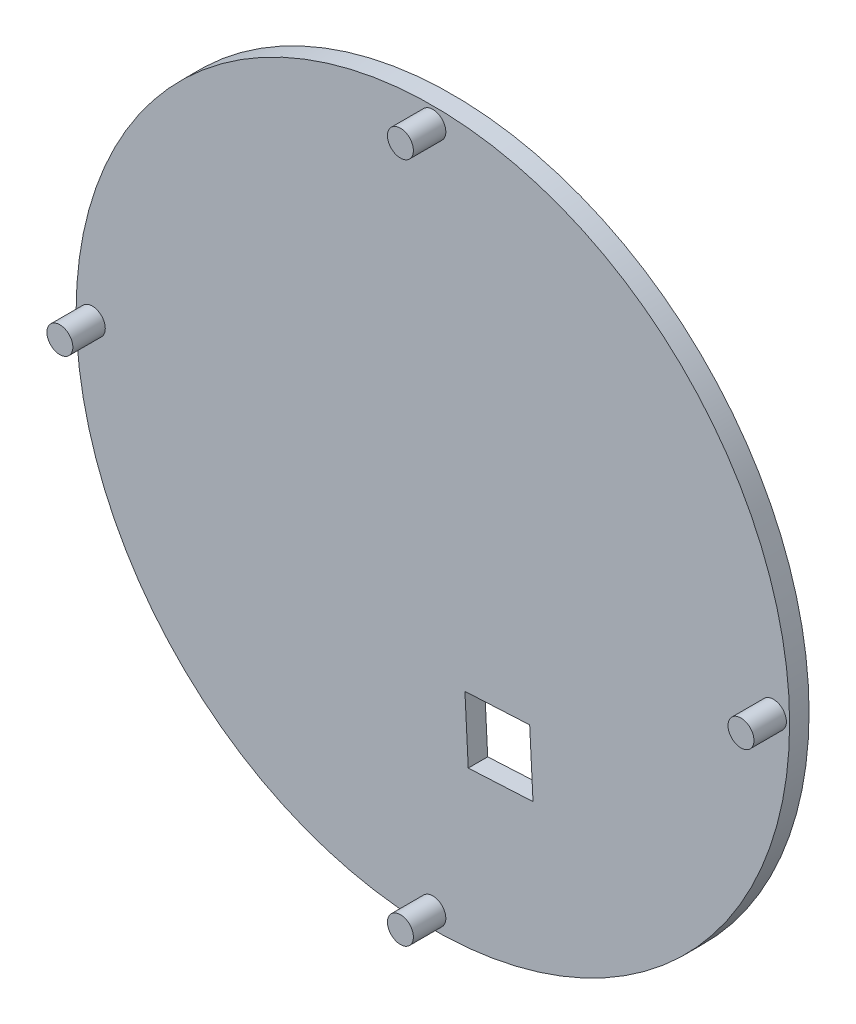
ISO-10303-21;
HEADER;
FILE_DESCRIPTION(('STEP AP214'),'2;1');
FILE_NAME('part.step','',(''),(''),'','','');
FILE_SCHEMA(('AUTOMOTIVE_DESIGN { 1 0 10303 214 1 1 1 1 }'));
ENDSEC;
DATA;
#1=APPLICATION_CONTEXT('core data for automotive mechanical design processes');
#2=APPLICATION_PROTOCOL_DEFINITION('international standard','automotive_design',2000,#1);
#3=PRODUCT_CONTEXT('',#1,'mechanical');
#4=PRODUCT('Part','Part','',(#3));
#5=PRODUCT_RELATED_PRODUCT_CATEGORY('part','',(#4));
#6=PRODUCT_DEFINITION_FORMATION('','',#4);
#7=PRODUCT_DEFINITION_CONTEXT('part definition',#1,'design');
#8=PRODUCT_DEFINITION('design','',#6,#7);
#9=PRODUCT_DEFINITION_SHAPE('','',#8);
#10=(LENGTH_UNIT() NAMED_UNIT(*) SI_UNIT(.MILLI.,.METRE.));
#11=(NAMED_UNIT(*) PLANE_ANGLE_UNIT() SI_UNIT($,.RADIAN.));
#12=(NAMED_UNIT(*) SI_UNIT($,.STERADIAN.) SOLID_ANGLE_UNIT());
#13=UNCERTAINTY_MEASURE_WITH_UNIT(LENGTH_MEASURE(1.E-05),#10,'distance_accuracy_value','');
#14=(GEOMETRIC_REPRESENTATION_CONTEXT(3) GLOBAL_UNCERTAINTY_ASSIGNED_CONTEXT((#13)) GLOBAL_UNIT_ASSIGNED_CONTEXT((#10,
#11,#12)) REPRESENTATION_CONTEXT('',''));
#15=CARTESIAN_POINT('',(0.,0.,0.));
#16=DIRECTION('',(0.,0.,1.));
#17=DIRECTION('',(1.,0.,0.));
#18=AXIS2_PLACEMENT_3D('',#15,#16,#17);
#19=CARTESIAN_POINT('',(0.,0.,3.));
#20=DIRECTION('',(0.,0.,-1.));
#21=DIRECTION('',(-1.,0.,0.));
#22=AXIS2_PLACEMENT_3D('',#19,#20,#21);
#23=CYLINDRICAL_SURFACE('',#22,55.);
#24=CARTESIAN_POINT('',(0.,0.,3.));
#25=DIRECTION('',(0.,0.,1.));
#26=DIRECTION('',(1.,0.,0.));
#27=AXIS2_PLACEMENT_3D('',#24,#25,#26);
#28=CIRCLE('',#27,55.);
#29=CARTESIAN_POINT('',(55.,0.,3.));
#30=VERTEX_POINT('',#29);
#31=EDGE_CURVE('E305',#30,#30,#28,.T.);
#32=ORIENTED_EDGE('',*,*,#31,.F.);
#33=EDGE_LOOP('',(#32));
#34=FACE_BOUND('',#33,.T.);
#35=CARTESIAN_POINT('',(0.,0.,0.));
#36=DIRECTION('',(0.,0.,1.));
#37=DIRECTION('',(1.,0.,0.));
#38=AXIS2_PLACEMENT_3D('',#35,#36,#37);
#39=CIRCLE('',#38,55.);
#40=CARTESIAN_POINT('',(55.,0.,0.));
#41=VERTEX_POINT('',#40);
#42=EDGE_CURVE('E45',#41,#41,#39,.T.);
#43=ORIENTED_EDGE('',*,*,#42,.T.);
#44=EDGE_LOOP('',(#43));
#45=FACE_BOUND('',#44,.T.);
#46=ADVANCED_FACE('F39',(#34,#45),#23,.T.);
#47=CARTESIAN_POINT('',(0.,0.,3.));
#48=DIRECTION('',(0.,0.,1.));
#49=DIRECTION('',(1.,0.,0.));
#50=AXIS2_PLACEMENT_3D('',#47,#48,#49);
#51=PLANE('',#50);
#52=DIRECTION('',(-0.998678015366775,-0.0514025449085839,0.));
#53=VECTOR('',#52,1.);
#54=CARTESIAN_POINT('',(1.07691285464527,-20.9228783188225,3.));
#55=LINE('',#54,#53);
#56=CARTESIAN_POINT('',(14.9275909821923,-20.2099757681399,3.));
#57=VERTEX_POINT('',#56);
#58=CARTESIAN_POINT('',(4.9408108285245,-20.7240012172258,3.));
#59=VERTEX_POINT('',#58);
#60=EDGE_CURVE('E186',#57,#59,#55,.T.);
#61=ORIENTED_EDGE('',*,*,#60,.F.);
#62=DIRECTION('',(-0.0514025449085844,0.998678015366775,0.));
#63=VECTOR('',#62,1.);
#64=CARTESIAN_POINT('',(13.850678127547,0.712902550682571,3.));
#65=LINE('',#64,#63);
#66=CARTESIAN_POINT('',(15.4416164312781,-30.1967559218077,3.));
#67=VERTEX_POINT('',#66);
#68=EDGE_CURVE('E178',#67,#57,#65,.T.);
#69=ORIENTED_EDGE('',*,*,#68,.F.);
#70=DIRECTION('',(0.998678015366775,0.0514025449085843,0.));
#71=VECTOR('',#70,1.);
#72=CARTESIAN_POINT('',(1.59093830373112,-30.9096584724902,3.));
#73=LINE('',#72,#71);
#74=CARTESIAN_POINT('',(5.45483627761034,-30.7107813708935,3.));
#75=VERTEX_POINT('',#74);
#76=EDGE_CURVE('E157',#75,#67,#73,.T.);
#77=ORIENTED_EDGE('',*,*,#76,.F.);
#78=DIRECTION('',(0.051402544908584,-0.998678015366775,0.));
#79=VECTOR('',#78,1.);
#80=CARTESIAN_POINT('',(3.86389797387923,0.198877101596725,3.));
#81=LINE('',#80,#79);
#82=EDGE_CURVE('E184',#59,#75,#81,.T.);
#83=ORIENTED_EDGE('',*,*,#82,.F.);
#84=EDGE_LOOP('',(#61,#69,#77,#83));
#85=FACE_BOUND('',#84,.T.);
#86=CARTESIAN_POINT('',(0.,52.50213424043,3.));
#87=DIRECTION('',(0.,0.,1.));
#88=DIRECTION('',(1.,0.,0.));
#89=AXIS2_PLACEMENT_3D('',#86,#87,#88);
#90=CIRCLE('',#89,2.);
#91=CARTESIAN_POINT('',(2.,52.50213424043,3.));
#92=VERTEX_POINT('',#91);
#93=EDGE_CURVE('E11',#92,#92,#90,.T.);
#94=ORIENTED_EDGE('',*,*,#93,.F.);
#95=EDGE_LOOP('',(#94));
#96=FACE_BOUND('',#95,.T.);
#97=CARTESIAN_POINT('',(52.50213424043,-1.83310221949899E-13,3.));
#98=DIRECTION('',(0.,0.,1.));
#99=DIRECTION('',(1.,0.,0.));
#100=AXIS2_PLACEMENT_3D('',#97,#98,#99);
#101=CIRCLE('',#100,2.);
#102=CARTESIAN_POINT('',(54.50213424043,-1.83310221949899E-13,3.));
#103=VERTEX_POINT('',#102);
#104=EDGE_CURVE('E50',#103,#103,#101,.T.);
#105=ORIENTED_EDGE('',*,*,#104,.F.);
#106=EDGE_LOOP('',(#105));
#107=FACE_BOUND('',#106,.T.);
#108=CARTESIAN_POINT('',(-3.66620443899797E-13,-52.50213424043,3.));
#109=DIRECTION('',(0.,0.,1.));
#110=DIRECTION('',(1.,0.,0.));
#111=AXIS2_PLACEMENT_3D('',#108,#109,#110);
#112=CIRCLE('',#111,2.);
#113=CARTESIAN_POINT('',(1.99999999999963,-52.50213424043,3.));
#114=VERTEX_POINT('',#113);
#115=EDGE_CURVE('E292',#114,#114,#112,.T.);
#116=ORIENTED_EDGE('',*,*,#115,.F.);
#117=EDGE_LOOP('',(#116));
#118=FACE_BOUND('',#117,.T.);
#119=CARTESIAN_POINT('',(-52.50213424043,5.49930665849696E-13,3.));
#120=DIRECTION('',(0.,0.,1.));
#121=DIRECTION('',(1.,0.,0.));
#122=AXIS2_PLACEMENT_3D('',#119,#120,#121);
#123=CIRCLE('',#122,2.);
#124=CARTESIAN_POINT('',(-50.50213424043,5.49930665849696E-13,3.));
#125=VERTEX_POINT('',#124);
#126=EDGE_CURVE('E297',#125,#125,#123,.T.);
#127=ORIENTED_EDGE('',*,*,#126,.F.);
#128=EDGE_LOOP('',(#127));
#129=FACE_BOUND('',#128,.T.);
#130=ORIENTED_EDGE('',*,*,#31,.T.);
#131=EDGE_LOOP('',(#130));
#132=FACE_BOUND('',#131,.T.);
#133=ADVANCED_FACE('F311',(#85,#96,#107,#118,#129,#132),#51,.T.);
#134=CARTESIAN_POINT('',(0.,0.,0.));
#135=DIRECTION('',(0.,0.,1.));
#136=DIRECTION('',(1.,0.,0.));
#137=AXIS2_PLACEMENT_3D('',#134,#135,#136);
#138=PLANE('',#137);
#139=DIRECTION('',(0.0514025449085844,-0.998678015366775,0.));
#140=VECTOR('',#139,1.);
#141=CARTESIAN_POINT('',(14.9275909821923,-20.2099757681399,0.));
#142=LINE('',#141,#140);
#143=CARTESIAN_POINT('',(14.9275909821923,-20.2099757681399,0.));
#144=VERTEX_POINT('',#143);
#145=CARTESIAN_POINT('',(15.4416164312781,-30.1967559218077,0.));
#146=VERTEX_POINT('',#145);
#147=EDGE_CURVE('E164',#144,#146,#142,.T.);
#148=ORIENTED_EDGE('',*,*,#147,.F.);
#149=DIRECTION('',(0.998678015366775,0.0514025449085839,0.));
#150=VECTOR('',#149,1.);
#151=CARTESIAN_POINT('',(14.9275909821923,-20.2099757681399,0.));
#152=LINE('',#151,#150);
#153=CARTESIAN_POINT('',(4.9408108285245,-20.7240012172258,0.));
#154=VERTEX_POINT('',#153);
#155=EDGE_CURVE('E64',#154,#144,#152,.T.);
#156=ORIENTED_EDGE('',*,*,#155,.F.);
#157=DIRECTION('',(-0.051402544908584,0.998678015366775,0.));
#158=VECTOR('',#157,1.);
#159=CARTESIAN_POINT('',(4.9408108285245,-20.7240012172258,0.));
#160=LINE('',#159,#158);
#161=CARTESIAN_POINT('',(5.45483627761034,-30.7107813708935,0.));
#162=VERTEX_POINT('',#161);
#163=EDGE_CURVE('E172',#162,#154,#160,.T.);
#164=ORIENTED_EDGE('',*,*,#163,.F.);
#165=DIRECTION('',(-0.998678015366775,-0.0514025449085843,0.));
#166=VECTOR('',#165,1.);
#167=CARTESIAN_POINT('',(5.45483627761034,-30.7107813708935,0.));
#168=LINE('',#167,#166);
#169=EDGE_CURVE('E156',#146,#162,#168,.T.);
#170=ORIENTED_EDGE('',*,*,#169,.F.);
#171=EDGE_LOOP('',(#148,#156,#164,#170));
#172=FACE_BOUND('',#171,.T.);
#173=CARTESIAN_POINT('',(18.7130524542113,0.115332129058666,0.));
#174=DIRECTION('',(0.,0.,-1.));
#175=DIRECTION('',(1.,0.,0.));
#176=AXIS2_PLACEMENT_3D('',#173,#174,#175);
#177=CIRCLE('',#176,1.99980087548018);
#178=CARTESIAN_POINT('',(18.9130701906319,2.10510509266242,0.));
#179=VERTEX_POINT('',#178);
#180=CARTESIAN_POINT('',(18.9130701906319,-1.87444083454508,0.));
#181=VERTEX_POINT('',#180);
#182=EDGE_CURVE('E229',#179,#181,#177,.T.);
#183=ORIENTED_EDGE('',*,*,#182,.F.);
#184=DIRECTION('',(0.996966855452382,-0.0778273032385734,0.));
#185=VECTOR('',#184,1.);
#186=CARTESIAN_POINT('',(18.9130701906319,2.10510509266242,0.));
#187=LINE('',#186,#185);
#188=CARTESIAN_POINT('',(2.,3.42540840587969,0.));
#189=VERTEX_POINT('',#188);
#190=EDGE_CURVE('E189',#189,#179,#187,.T.);
#191=ORIENTED_EDGE('',*,*,#190,.F.);
#192=DIRECTION('',(0.,-1.,0.));
#193=VECTOR('',#192,1.);
#194=CARTESIAN_POINT('',(2.,3.42540840587969,0.));
#195=LINE('',#194,#193);
#196=CARTESIAN_POINT('',(2.,8.42540840587969,0.));
#197=VERTEX_POINT('',#196);
#198=EDGE_CURVE('E192',#197,#189,#195,.T.);
#199=ORIENTED_EDGE('',*,*,#198,.F.);
#200=CARTESIAN_POINT('',(0.,8.42540840587969,0.));
#201=DIRECTION('',(0.,0.,-1.));
#202=DIRECTION('',(1.,0.,0.));
#203=AXIS2_PLACEMENT_3D('',#200,#201,#202);
#204=CIRCLE('',#203,2.);
#205=CARTESIAN_POINT('',(-2.,8.42540840587969,0.));
#206=VERTEX_POINT('',#205);
#207=EDGE_CURVE('E254',#206,#197,#204,.T.);
#208=ORIENTED_EDGE('',*,*,#207,.F.);
#209=DIRECTION('',(0.,1.,0.));
#210=VECTOR('',#209,1.);
#211=CARTESIAN_POINT('',(-2.,8.42540840587969,0.));
#212=LINE('',#211,#210);
#213=CARTESIAN_POINT('',(-2.,3.42540840587969,0.));
#214=VERTEX_POINT('',#213);
#215=EDGE_CURVE('E252',#214,#206,#212,.T.);
#216=ORIENTED_EDGE('',*,*,#215,.F.);
#217=DIRECTION('',(0.994719011494267,0.102635706125444,0.));
#218=VECTOR('',#217,1.);
#219=CARTESIAN_POINT('',(-2.,3.42540840587969,0.));
#220=LINE('',#219,#218);
#221=CARTESIAN_POINT('',(-15.9260661609197,1.98850852012348,0.));
#222=VERTEX_POINT('',#221);
#223=EDGE_CURVE('E248',#222,#214,#220,.T.);
#224=ORIENTED_EDGE('',*,*,#223,.F.);
#225=CARTESIAN_POINT('',(-15.7208906553337,0.,0.));
#226=DIRECTION('',(0.,0.,-1.));
#227=DIRECTION('',(1.,0.,0.));
#228=AXIS2_PLACEMENT_3D('',#225,#226,#227);
#229=CIRCLE('',#228,1.99906556238061);
#230=CARTESIAN_POINT('',(-15.9575359763334,-1.98500934878028,0.));
#231=VERTEX_POINT('',#230);
#232=EDGE_CURVE('E246',#231,#222,#229,.T.);
#233=ORIENTED_EDGE('',*,*,#232,.F.);
#234=DIRECTION('',(-0.996966855452382,0.0778273032385739,0.));
#235=VECTOR('',#234,1.);
#236=CARTESIAN_POINT('',(-15.9575359763334,-1.98500934878028,0.));
#237=LINE('',#236,#235);
#238=CARTESIAN_POINT('',(-2.,-3.07459159412031,0.));
#239=VERTEX_POINT('',#238);
#240=EDGE_CURVE('E244',#239,#231,#237,.T.);
#241=ORIENTED_EDGE('',*,*,#240,.F.);
#242=DIRECTION('',(0.,1.,0.));
#243=VECTOR('',#242,1.);
#244=CARTESIAN_POINT('',(-2.,-3.07459159412031,0.));
#245=LINE('',#244,#243);
#246=CARTESIAN_POINT('',(-2.,-8.57459159412032,0.));
#247=VERTEX_POINT('',#246);
#248=EDGE_CURVE('E238',#247,#239,#245,.T.);
#249=ORIENTED_EDGE('',*,*,#248,.F.);
#250=CARTESIAN_POINT('',(0.,-8.57459159412032,0.));
#251=DIRECTION('',(0.,0.,-1.));
#252=DIRECTION('',(1.,0.,0.));
#253=AXIS2_PLACEMENT_3D('',#250,#251,#252);
#254=CIRCLE('',#253,2.);
#255=CARTESIAN_POINT('',(2.,-8.57459159412032,0.));
#256=VERTEX_POINT('',#255);
#257=EDGE_CURVE('E240',#256,#247,#254,.T.);
#258=ORIENTED_EDGE('',*,*,#257,.F.);
#259=DIRECTION('',(0.,-1.,0.));
#260=VECTOR('',#259,1.);
#261=CARTESIAN_POINT('',(2.,-8.57459159412032,0.));
#262=LINE('',#261,#260);
#263=CARTESIAN_POINT('',(2.,-3.57459159412031,0.));
#264=VERTEX_POINT('',#263);
#265=EDGE_CURVE('E233',#264,#256,#262,.T.);
#266=ORIENTED_EDGE('',*,*,#265,.F.);
#267=DIRECTION('',(-0.994985544811296,-0.100018826310689,0.));
#268=VECTOR('',#267,1.);
#269=CARTESIAN_POINT('',(2.,-3.57459159412031,0.));
#270=LINE('',#269,#268);
#271=EDGE_CURVE('E231',#181,#264,#270,.T.);
#272=ORIENTED_EDGE('',*,*,#271,.F.);
#273=EDGE_LOOP('',(#183,#191,#199,#208,#216,#224,#233,#241,#249,#258,#266,#272));
#274=FACE_BOUND('',#273,.T.);
#275=ORIENTED_EDGE('',*,*,#42,.F.);
#276=EDGE_LOOP('',(#275));
#277=FACE_BOUND('',#276,.T.);
#278=ADVANCED_FACE('F166',(#172,#274,#277),#138,.F.);
#279=CARTESIAN_POINT('',(-52.50213424043,5.49930665849696E-13,8.));
#280=DIRECTION('',(0.,0.,-1.));
#281=DIRECTION('',(-1.,0.,0.));
#282=AXIS2_PLACEMENT_3D('',#279,#280,#281);
#283=CYLINDRICAL_SURFACE('',#282,2.);
#284=CARTESIAN_POINT('',(-52.50213424043,5.49930665849696E-13,8.));
#285=DIRECTION('',(0.,0.,1.));
#286=DIRECTION('',(1.,0.,0.));
#287=AXIS2_PLACEMENT_3D('',#284,#285,#286);
#288=CIRCLE('',#287,2.);
#289=CARTESIAN_POINT('',(-50.50213424043,5.49930665849696E-13,8.));
#290=VERTEX_POINT('',#289);
#291=EDGE_CURVE('E265',#290,#290,#288,.T.);
#292=ORIENTED_EDGE('',*,*,#291,.F.);
#293=EDGE_LOOP('',(#292));
#294=FACE_BOUND('',#293,.T.);
#295=ORIENTED_EDGE('',*,*,#126,.T.);
#296=EDGE_LOOP('',(#295));
#297=FACE_BOUND('',#296,.T.);
#298=ADVANCED_FACE('F315',(#294,#297),#283,.T.);
#299=CARTESIAN_POINT('',(-52.50213424043,5.49930665849696E-13,8.));
#300=DIRECTION('',(0.,0.,1.));
#301=DIRECTION('',(1.,0.,0.));
#302=AXIS2_PLACEMENT_3D('',#299,#300,#301);
#303=PLANE('',#302);
#304=ORIENTED_EDGE('',*,*,#291,.T.);
#305=EDGE_LOOP('',(#304));
#306=FACE_BOUND('',#305,.T.);
#307=ADVANCED_FACE('F317',(#306),#303,.T.);
#308=CARTESIAN_POINT('',(-3.66620443899797E-13,-52.50213424043,8.));
#309=DIRECTION('',(0.,0.,-1.));
#310=DIRECTION('',(-1.,0.,0.));
#311=AXIS2_PLACEMENT_3D('',#308,#309,#310);
#312=CYLINDRICAL_SURFACE('',#311,2.);
#313=CARTESIAN_POINT('',(-3.66620443899797E-13,-52.50213424043,8.));
#314=DIRECTION('',(0.,0.,1.));
#315=DIRECTION('',(1.,0.,0.));
#316=AXIS2_PLACEMENT_3D('',#313,#314,#315);
#317=CIRCLE('',#316,2.);
#318=CARTESIAN_POINT('',(1.99999999999963,-52.50213424043,8.));
#319=VERTEX_POINT('',#318);
#320=EDGE_CURVE('E294',#319,#319,#317,.T.);
#321=ORIENTED_EDGE('',*,*,#320,.F.);
#322=EDGE_LOOP('',(#321));
#323=FACE_BOUND('',#322,.T.);
#324=ORIENTED_EDGE('',*,*,#115,.T.);
#325=EDGE_LOOP('',(#324));
#326=FACE_BOUND('',#325,.T.);
#327=ADVANCED_FACE('F341',(#323,#326),#312,.T.);
#328=CARTESIAN_POINT('',(-3.66620443899797E-13,-52.50213424043,8.));
#329=DIRECTION('',(0.,0.,1.));
#330=DIRECTION('',(1.,0.,0.));
#331=AXIS2_PLACEMENT_3D('',#328,#329,#330);
#332=PLANE('',#331);
#333=ORIENTED_EDGE('',*,*,#320,.T.);
#334=EDGE_LOOP('',(#333));
#335=FACE_BOUND('',#334,.T.);
#336=ADVANCED_FACE('F348',(#335),#332,.T.);
#337=CARTESIAN_POINT('',(52.50213424043,-1.83310221949899E-13,8.));
#338=DIRECTION('',(0.,0.,-1.));
#339=DIRECTION('',(-1.,0.,0.));
#340=AXIS2_PLACEMENT_3D('',#337,#338,#339);
#341=CYLINDRICAL_SURFACE('',#340,2.);
#342=CARTESIAN_POINT('',(52.50213424043,-1.83310221949899E-13,8.));
#343=DIRECTION('',(0.,0.,1.));
#344=DIRECTION('',(1.,0.,0.));
#345=AXIS2_PLACEMENT_3D('',#342,#343,#344);
#346=CIRCLE('',#345,2.);
#347=CARTESIAN_POINT('',(54.50213424043,-1.83310221949899E-13,8.));
#348=VERTEX_POINT('',#347);
#349=EDGE_CURVE('E290',#348,#348,#346,.T.);
#350=ORIENTED_EDGE('',*,*,#349,.F.);
#351=EDGE_LOOP('',(#350));
#352=FACE_BOUND('',#351,.T.);
#353=ORIENTED_EDGE('',*,*,#104,.T.);
#354=EDGE_LOOP('',(#353));
#355=FACE_BOUND('',#354,.T.);
#356=ADVANCED_FACE('F358',(#352,#355),#341,.T.);
#357=CARTESIAN_POINT('',(52.50213424043,-1.83310221949899E-13,8.));
#358=DIRECTION('',(0.,0.,1.));
#359=DIRECTION('',(1.,0.,0.));
#360=AXIS2_PLACEMENT_3D('',#357,#358,#359);
#361=PLANE('',#360);
#362=ORIENTED_EDGE('',*,*,#349,.T.);
#363=EDGE_LOOP('',(#362));
#364=FACE_BOUND('',#363,.T.);
#365=ADVANCED_FACE('F366',(#364),#361,.T.);
#366=CARTESIAN_POINT('',(0.,52.50213424043,8.));
#367=DIRECTION('',(0.,0.,-1.));
#368=DIRECTION('',(-1.,0.,0.));
#369=AXIS2_PLACEMENT_3D('',#366,#367,#368);
#370=CYLINDRICAL_SURFACE('',#369,2.);
#371=CARTESIAN_POINT('',(0.,52.50213424043,8.));
#372=DIRECTION('',(0.,0.,1.));
#373=DIRECTION('',(1.,0.,0.));
#374=AXIS2_PLACEMENT_3D('',#371,#372,#373);
#375=CIRCLE('',#374,2.);
#376=CARTESIAN_POINT('',(2.,52.50213424043,8.));
#377=VERTEX_POINT('',#376);
#378=EDGE_CURVE('E285',#377,#377,#375,.T.);
#379=ORIENTED_EDGE('',*,*,#378,.F.);
#380=EDGE_LOOP('',(#379));
#381=FACE_BOUND('',#380,.T.);
#382=ORIENTED_EDGE('',*,*,#93,.T.);
#383=EDGE_LOOP('',(#382));
#384=FACE_BOUND('',#383,.T.);
#385=ADVANCED_FACE('F380',(#381,#384),#370,.T.);
#386=CARTESIAN_POINT('',(0.,52.50213424043,8.));
#387=DIRECTION('',(0.,0.,1.));
#388=DIRECTION('',(1.,0.,0.));
#389=AXIS2_PLACEMENT_3D('',#386,#387,#388);
#390=PLANE('',#389);
#391=ORIENTED_EDGE('',*,*,#378,.T.);
#392=EDGE_LOOP('',(#391));
#393=FACE_BOUND('',#392,.T.);
#394=ADVANCED_FACE('F387',(#393),#390,.T.);
#395=CARTESIAN_POINT('',(18.9130701906319,2.10510509266242,1.5));
#396=DIRECTION('',(0.0778273032385734,0.996966855452382,0.));
#397=DIRECTION('',(-0.996966855452382,0.0778273032385734,0.));
#398=AXIS2_PLACEMENT_3D('',#395,#396,#397);
#399=PLANE('',#398);
#400=ORIENTED_EDGE('',*,*,#190,.T.);
#401=DIRECTION('',(0.,0.,-1.));
#402=VECTOR('',#401,1.);
#403=CARTESIAN_POINT('',(18.9130701906319,2.10510509266242,1.5));
#404=LINE('',#403,#402);
#405=CARTESIAN_POINT('',(18.9130701906319,2.10510509266242,1.5));
#406=VERTEX_POINT('',#405);
#407=EDGE_CURVE('E226',#406,#179,#404,.T.);
#408=ORIENTED_EDGE('',*,*,#407,.F.);
#409=DIRECTION('',(0.996966855452382,-0.0778273032385734,0.));
#410=VECTOR('',#409,1.);
#411=CARTESIAN_POINT('',(18.9130701906319,2.10510509266242,1.5));
#412=LINE('',#411,#410);
#413=CARTESIAN_POINT('',(2.,3.42540840587969,1.5));
#414=VERTEX_POINT('',#413);
#415=EDGE_CURVE('E188',#414,#406,#412,.T.);
#416=ORIENTED_EDGE('',*,*,#415,.F.);
#417=DIRECTION('',(0.,0.,-1.));
#418=VECTOR('',#417,1.);
#419=CARTESIAN_POINT('',(2.,3.42540840587969,1.5));
#420=LINE('',#419,#418);
#421=EDGE_CURVE('E257',#414,#189,#420,.T.);
#422=ORIENTED_EDGE('',*,*,#421,.T.);
#423=EDGE_LOOP('',(#400,#408,#416,#422));
#424=FACE_BOUND('',#423,.T.);
#425=ADVANCED_FACE('F395',(#424),#399,.F.);
#426=CARTESIAN_POINT('',(2.,3.42540840587969,1.5));
#427=DIRECTION('',(1.,0.,0.));
#428=DIRECTION('',(0.,0.,-1.));
#429=AXIS2_PLACEMENT_3D('',#426,#427,#428);
#430=PLANE('',#429);
#431=ORIENTED_EDGE('',*,*,#198,.T.);
#432=ORIENTED_EDGE('',*,*,#421,.F.);
#433=DIRECTION('',(0.,-1.,0.));
#434=VECTOR('',#433,1.);
#435=CARTESIAN_POINT('',(2.,3.42540840587969,1.5));
#436=LINE('',#435,#434);
#437=CARTESIAN_POINT('',(2.,8.42540840587969,1.5));
#438=VERTEX_POINT('',#437);
#439=EDGE_CURVE('E224',#438,#414,#436,.T.);
#440=ORIENTED_EDGE('',*,*,#439,.F.);
#441=DIRECTION('',(0.,0.,-1.));
#442=VECTOR('',#441,1.);
#443=CARTESIAN_POINT('',(2.,8.42540840587969,1.5));
#444=LINE('',#443,#442);
#445=EDGE_CURVE('E263',#438,#197,#444,.T.);
#446=ORIENTED_EDGE('',*,*,#445,.T.);
#447=EDGE_LOOP('',(#431,#432,#440,#446));
#448=FACE_BOUND('',#447,.T.);
#449=ADVANCED_FACE('F404',(#448),#430,.F.);
#450=CARTESIAN_POINT('',(0.,8.42540840587969,1.5));
#451=DIRECTION('',(0.,0.,-1.));
#452=DIRECTION('',(-1.,0.,0.));
#453=AXIS2_PLACEMENT_3D('',#450,#451,#452);
#454=CYLINDRICAL_SURFACE('',#453,2.);
#455=ORIENTED_EDGE('',*,*,#207,.T.);
#456=ORIENTED_EDGE('',*,*,#445,.F.);
#457=CARTESIAN_POINT('',(0.,8.42540840587969,1.5));
#458=DIRECTION('',(0.,0.,-1.));
#459=DIRECTION('',(1.,0.,0.));
#460=AXIS2_PLACEMENT_3D('',#457,#458,#459);
#461=CIRCLE('',#460,2.);
#462=CARTESIAN_POINT('',(-2.,8.42540840587969,1.5));
#463=VERTEX_POINT('',#462);
#464=EDGE_CURVE('E219',#463,#438,#461,.T.);
#465=ORIENTED_EDGE('',*,*,#464,.F.);
#466=DIRECTION('',(0.,0.,-1.));
#467=VECTOR('',#466,1.);
#468=CARTESIAN_POINT('',(-2.,8.42540840587969,1.5));
#469=LINE('',#468,#467);
#470=EDGE_CURVE('E264',#463,#206,#469,.T.);
#471=ORIENTED_EDGE('',*,*,#470,.T.);
#472=EDGE_LOOP('',(#455,#456,#465,#471));
#473=FACE_BOUND('',#472,.T.);
#474=ADVANCED_FACE('F412',(#473),#454,.F.);
#475=CARTESIAN_POINT('',(-2.,8.42540840587969,1.5));
#476=DIRECTION('',(-1.,0.,0.));
#477=DIRECTION('',(0.,0.,1.));
#478=AXIS2_PLACEMENT_3D('',#475,#476,#477);
#479=PLANE('',#478);
#480=ORIENTED_EDGE('',*,*,#215,.T.);
#481=ORIENTED_EDGE('',*,*,#470,.F.);
#482=DIRECTION('',(0.,1.,0.));
#483=VECTOR('',#482,1.);
#484=CARTESIAN_POINT('',(-2.,8.42540840587969,1.5));
#485=LINE('',#484,#483);
#486=CARTESIAN_POINT('',(-2.,3.42540840587969,1.5));
#487=VERTEX_POINT('',#486);
#488=EDGE_CURVE('E220',#487,#463,#485,.T.);
#489=ORIENTED_EDGE('',*,*,#488,.F.);
#490=DIRECTION('',(0.,0.,-1.));
#491=VECTOR('',#490,1.);
#492=CARTESIAN_POINT('',(-2.,3.42540840587969,1.5));
#493=LINE('',#492,#491);
#494=EDGE_CURVE('E270',#487,#214,#493,.T.);
#495=ORIENTED_EDGE('',*,*,#494,.T.);
#496=EDGE_LOOP('',(#480,#481,#489,#495));
#497=FACE_BOUND('',#496,.T.);
#498=ADVANCED_FACE('F425',(#497),#479,.F.);
#499=CARTESIAN_POINT('',(-2.,3.42540840587969,1.5));
#500=DIRECTION('',(-0.102635706125444,0.994719011494267,0.));
#501=DIRECTION('',(-0.994719011494267,-0.102635706125444,0.));
#502=AXIS2_PLACEMENT_3D('',#499,#500,#501);
#503=PLANE('',#502);
#504=ORIENTED_EDGE('',*,*,#223,.T.);
#505=ORIENTED_EDGE('',*,*,#494,.F.);
#506=DIRECTION('',(0.994719011494267,0.102635706125444,0.));
#507=VECTOR('',#506,1.);
#508=CARTESIAN_POINT('',(-2.,3.42540840587969,1.5));
#509=LINE('',#508,#507);
#510=CARTESIAN_POINT('',(-15.9260661609197,1.98850852012348,1.5));
#511=VERTEX_POINT('',#510);
#512=EDGE_CURVE('E212',#511,#487,#509,.T.);
#513=ORIENTED_EDGE('',*,*,#512,.F.);
#514=DIRECTION('',(0.,0.,-1.));
#515=VECTOR('',#514,1.);
#516=CARTESIAN_POINT('',(-15.9260661609197,1.98850852012348,1.5));
#517=LINE('',#516,#515);
#518=EDGE_CURVE('E267',#511,#222,#517,.T.);
#519=ORIENTED_EDGE('',*,*,#518,.T.);
#520=EDGE_LOOP('',(#504,#505,#513,#519));
#521=FACE_BOUND('',#520,.T.);
#522=ADVANCED_FACE('F431',(#521),#503,.F.);
#523=CARTESIAN_POINT('',(-15.7208906553337,0.,1.5));
#524=DIRECTION('',(0.,0.,-1.));
#525=DIRECTION('',(-1.,0.,0.));
#526=AXIS2_PLACEMENT_3D('',#523,#524,#525);
#527=CYLINDRICAL_SURFACE('',#526,1.99906556238061);
#528=ORIENTED_EDGE('',*,*,#232,.T.);
#529=ORIENTED_EDGE('',*,*,#518,.F.);
#530=CARTESIAN_POINT('',(-15.7208906553337,0.,1.5));
#531=DIRECTION('',(0.,0.,-1.));
#532=DIRECTION('',(1.,0.,0.));
#533=AXIS2_PLACEMENT_3D('',#530,#531,#532);
#534=CIRCLE('',#533,1.99906556238061);
#535=CARTESIAN_POINT('',(-15.9575359763334,-1.98500934878028,1.5));
#536=VERTEX_POINT('',#535);
#537=EDGE_CURVE('E211',#536,#511,#534,.T.);
#538=ORIENTED_EDGE('',*,*,#537,.F.);
#539=DIRECTION('',(0.,0.,-1.));
#540=VECTOR('',#539,1.);
#541=CARTESIAN_POINT('',(-15.9575359763334,-1.98500934878028,1.5));
#542=LINE('',#541,#540);
#543=EDGE_CURVE('E271',#536,#231,#542,.T.);
#544=ORIENTED_EDGE('',*,*,#543,.T.);
#545=EDGE_LOOP('',(#528,#529,#538,#544));
#546=FACE_BOUND('',#545,.T.);
#547=ADVANCED_FACE('F439',(#546),#527,.F.);
#548=CARTESIAN_POINT('',(-15.9575359763334,-1.98500934878028,1.5));
#549=DIRECTION('',(-0.0778273032385739,-0.996966855452382,0.));
#550=DIRECTION('',(0.996966855452382,-0.077827303238574,0.));
#551=AXIS2_PLACEMENT_3D('',#548,#549,#550);
#552=PLANE('',#551);
#553=ORIENTED_EDGE('',*,*,#240,.T.);
#554=ORIENTED_EDGE('',*,*,#543,.F.);
#555=DIRECTION('',(-0.996966855452382,0.0778273032385739,0.));
#556=VECTOR('',#555,1.);
#557=CARTESIAN_POINT('',(-15.9575359763334,-1.98500934878028,1.5));
#558=LINE('',#557,#556);
#559=CARTESIAN_POINT('',(-2.,-3.07459159412031,1.5));
#560=VERTEX_POINT('',#559);
#561=EDGE_CURVE('E208',#560,#536,#558,.T.);
#562=ORIENTED_EDGE('',*,*,#561,.F.);
#563=DIRECTION('',(0.,0.,-1.));
#564=VECTOR('',#563,1.);
#565=CARTESIAN_POINT('',(-2.,-3.07459159412031,1.5));
#566=LINE('',#565,#564);
#567=EDGE_CURVE('E272',#560,#239,#566,.T.);
#568=ORIENTED_EDGE('',*,*,#567,.T.);
#569=EDGE_LOOP('',(#553,#554,#562,#568));
#570=FACE_BOUND('',#569,.T.);
#571=ADVANCED_FACE('F448',(#570),#552,.F.);
#572=CARTESIAN_POINT('',(-2.,-3.07459159412031,1.5));
#573=DIRECTION('',(-1.,0.,0.));
#574=DIRECTION('',(0.,0.,1.));
#575=AXIS2_PLACEMENT_3D('',#572,#573,#574);
#576=PLANE('',#575);
#577=ORIENTED_EDGE('',*,*,#248,.T.);
#578=ORIENTED_EDGE('',*,*,#567,.F.);
#579=DIRECTION('',(0.,1.,0.));
#580=VECTOR('',#579,1.);
#581=CARTESIAN_POINT('',(-2.,-3.07459159412031,1.5));
#582=LINE('',#581,#580);
#583=CARTESIAN_POINT('',(-2.,-8.57459159412032,1.5));
#584=VERTEX_POINT('',#583);
#585=EDGE_CURVE('E202',#584,#560,#582,.T.);
#586=ORIENTED_EDGE('',*,*,#585,.F.);
#587=DIRECTION('',(0.,0.,-1.));
#588=VECTOR('',#587,1.);
#589=CARTESIAN_POINT('',(-2.,-8.57459159412032,1.5));
#590=LINE('',#589,#588);
#591=EDGE_CURVE('E274',#584,#247,#590,.T.);
#592=ORIENTED_EDGE('',*,*,#591,.T.);
#593=EDGE_LOOP('',(#577,#578,#586,#592));
#594=FACE_BOUND('',#593,.T.);
#595=ADVANCED_FACE('F456',(#594),#576,.F.);
#596=CARTESIAN_POINT('',(0.,-8.57459159412032,1.5));
#597=DIRECTION('',(0.,0.,-1.));
#598=DIRECTION('',(-1.,0.,0.));
#599=AXIS2_PLACEMENT_3D('',#596,#597,#598);
#600=CYLINDRICAL_SURFACE('',#599,2.);
#601=ORIENTED_EDGE('',*,*,#257,.T.);
#602=ORIENTED_EDGE('',*,*,#591,.F.);
#603=CARTESIAN_POINT('',(0.,-8.57459159412032,1.5));
#604=DIRECTION('',(0.,0.,-1.));
#605=DIRECTION('',(1.,0.,0.));
#606=AXIS2_PLACEMENT_3D('',#603,#604,#605);
#607=CIRCLE('',#606,2.);
#608=CARTESIAN_POINT('',(2.,-8.57459159412032,1.5));
#609=VERTEX_POINT('',#608);
#610=EDGE_CURVE('E205',#609,#584,#607,.T.);
#611=ORIENTED_EDGE('',*,*,#610,.F.);
#612=DIRECTION('',(0.,0.,-1.));
#613=VECTOR('',#612,1.);
#614=CARTESIAN_POINT('',(2.,-8.57459159412032,1.5));
#615=LINE('',#614,#613);
#616=EDGE_CURVE('E280',#609,#256,#615,.T.);
#617=ORIENTED_EDGE('',*,*,#616,.T.);
#618=EDGE_LOOP('',(#601,#602,#611,#617));
#619=FACE_BOUND('',#618,.T.);
#620=ADVANCED_FACE('F470',(#619),#600,.F.);
#621=CARTESIAN_POINT('',(2.,-8.57459159412032,1.5));
#622=DIRECTION('',(1.,0.,0.));
#623=DIRECTION('',(0.,0.,-1.));
#624=AXIS2_PLACEMENT_3D('',#621,#622,#623);
#625=PLANE('',#624);
#626=ORIENTED_EDGE('',*,*,#265,.T.);
#627=ORIENTED_EDGE('',*,*,#616,.F.);
#628=DIRECTION('',(0.,-1.,0.));
#629=VECTOR('',#628,1.);
#630=CARTESIAN_POINT('',(2.,-8.57459159412032,1.5));
#631=LINE('',#630,#629);
#632=CARTESIAN_POINT('',(2.,-3.57459159412031,1.5));
#633=VERTEX_POINT('',#632);
#634=EDGE_CURVE('E200',#633,#609,#631,.T.);
#635=ORIENTED_EDGE('',*,*,#634,.F.);
#636=DIRECTION('',(0.,0.,-1.));
#637=VECTOR('',#636,1.);
#638=CARTESIAN_POINT('',(2.,-3.57459159412031,1.5));
#639=LINE('',#638,#637);
#640=EDGE_CURVE('E276',#633,#264,#639,.T.);
#641=ORIENTED_EDGE('',*,*,#640,.T.);
#642=EDGE_LOOP('',(#626,#627,#635,#641));
#643=FACE_BOUND('',#642,.T.);
#644=ADVANCED_FACE('F478',(#643),#625,.F.);
#645=CARTESIAN_POINT('',(2.,-3.57459159412031,1.5));
#646=DIRECTION('',(0.100018826310689,-0.994985544811296,0.));
#647=DIRECTION('',(0.994985544811297,0.100018826310689,0.));
#648=AXIS2_PLACEMENT_3D('',#645,#646,#647);
#649=PLANE('',#648);
#650=ORIENTED_EDGE('',*,*,#271,.T.);
#651=ORIENTED_EDGE('',*,*,#640,.F.);
#652=DIRECTION('',(-0.994985544811296,-0.100018826310689,0.));
#653=VECTOR('',#652,1.);
#654=CARTESIAN_POINT('',(2.,-3.57459159412031,1.5));
#655=LINE('',#654,#653);
#656=CARTESIAN_POINT('',(18.9130701906319,-1.87444083454508,1.5));
#657=VERTEX_POINT('',#656);
#658=EDGE_CURVE('E198',#657,#633,#655,.T.);
#659=ORIENTED_EDGE('',*,*,#658,.F.);
#660=DIRECTION('',(0.,0.,-1.));
#661=VECTOR('',#660,1.);
#662=CARTESIAN_POINT('',(18.9130701906319,-1.87444083454508,1.5));
#663=LINE('',#662,#661);
#664=EDGE_CURVE('E281',#657,#181,#663,.T.);
#665=ORIENTED_EDGE('',*,*,#664,.T.);
#666=EDGE_LOOP('',(#650,#651,#659,#665));
#667=FACE_BOUND('',#666,.T.);
#668=ADVANCED_FACE('F484',(#667),#649,.F.);
#669=CARTESIAN_POINT('',(18.7130524542113,0.115332129058666,1.5));
#670=DIRECTION('',(0.,0.,-1.));
#671=DIRECTION('',(-1.,0.,0.));
#672=AXIS2_PLACEMENT_3D('',#669,#670,#671);
#673=CYLINDRICAL_SURFACE('',#672,1.99980087548018);
#674=ORIENTED_EDGE('',*,*,#182,.T.);
#675=ORIENTED_EDGE('',*,*,#664,.F.);
#676=CARTESIAN_POINT('',(18.7130524542113,0.115332129058666,1.5));
#677=DIRECTION('',(0.,0.,-1.));
#678=DIRECTION('',(1.,0.,0.));
#679=AXIS2_PLACEMENT_3D('',#676,#677,#678);
#680=CIRCLE('',#679,1.99980087548018);
#681=EDGE_CURVE('E195',#406,#657,#680,.T.);
#682=ORIENTED_EDGE('',*,*,#681,.F.);
#683=ORIENTED_EDGE('',*,*,#407,.T.);
#684=EDGE_LOOP('',(#674,#675,#682,#683));
#685=FACE_BOUND('',#684,.T.);
#686=ADVANCED_FACE('F493',(#685),#673,.F.);
#687=CARTESIAN_POINT('',(0.,8.42540840587969,1.5));
#688=DIRECTION('',(0.,0.,1.));
#689=DIRECTION('',(1.,0.,0.));
#690=AXIS2_PLACEMENT_3D('',#687,#688,#689);
#691=PLANE('',#690);
#692=ORIENTED_EDGE('',*,*,#415,.T.);
#693=ORIENTED_EDGE('',*,*,#681,.T.);
#694=ORIENTED_EDGE('',*,*,#658,.T.);
#695=ORIENTED_EDGE('',*,*,#634,.T.);
#696=ORIENTED_EDGE('',*,*,#610,.T.);
#697=ORIENTED_EDGE('',*,*,#585,.T.);
#698=ORIENTED_EDGE('',*,*,#561,.T.);
#699=ORIENTED_EDGE('',*,*,#537,.T.);
#700=ORIENTED_EDGE('',*,*,#512,.T.);
#701=ORIENTED_EDGE('',*,*,#488,.T.);
#702=ORIENTED_EDGE('',*,*,#464,.T.);
#703=ORIENTED_EDGE('',*,*,#439,.T.);
#704=EDGE_LOOP('',(#692,#693,#694,#695,#696,#697,#698,#699,#700,#701,#702,#703));
#705=FACE_BOUND('',#704,.T.);
#706=ADVANCED_FACE('F504',(#705),#691,.F.);
#707=CARTESIAN_POINT('',(14.9275909821923,-20.2099757681399,23.5));
#708=DIRECTION('',(-0.0514025449085839,0.998678015366775,0.));
#709=DIRECTION('',(-0.998678015366775,-0.0514025449085839,0.));
#710=AXIS2_PLACEMENT_3D('',#707,#708,#709);
#711=PLANE('',#710);
#712=ORIENTED_EDGE('',*,*,#60,.T.);
#713=DIRECTION('',(0.,0.,-1.));
#714=VECTOR('',#713,1.);
#715=CARTESIAN_POINT('',(4.9408108285245,-20.7240012172258,23.5));
#716=LINE('',#715,#714);
#717=EDGE_CURVE('E180',#59,#154,#716,.T.);
#718=ORIENTED_EDGE('',*,*,#717,.T.);
#719=ORIENTED_EDGE('',*,*,#155,.T.);
#720=DIRECTION('',(0.,0.,-1.));
#721=VECTOR('',#720,1.);
#722=CARTESIAN_POINT('',(14.9275909821923,-20.2099757681399,23.5));
#723=LINE('',#722,#721);
#724=EDGE_CURVE('E165',#57,#144,#723,.T.);
#725=ORIENTED_EDGE('',*,*,#724,.F.);
#726=EDGE_LOOP('',(#712,#718,#719,#725));
#727=FACE_BOUND('',#726,.T.);
#728=ADVANCED_FACE('F512',(#727),#711,.F.);
#729=CARTESIAN_POINT('',(4.9408108285245,-20.7240012172258,23.5));
#730=DIRECTION('',(-0.998678015366775,-0.051402544908584,0.));
#731=DIRECTION('',(0.051402544908584,-0.998678015366775,0.));
#732=AXIS2_PLACEMENT_3D('',#729,#730,#731);
#733=PLANE('',#732);
#734=ORIENTED_EDGE('',*,*,#82,.T.);
#735=DIRECTION('',(0.,0.,-1.));
#736=VECTOR('',#735,1.);
#737=CARTESIAN_POINT('',(5.45483627761034,-30.7107813708935,23.5));
#738=LINE('',#737,#736);
#739=EDGE_CURVE('E161',#75,#162,#738,.T.);
#740=ORIENTED_EDGE('',*,*,#739,.T.);
#741=ORIENTED_EDGE('',*,*,#163,.T.);
#742=ORIENTED_EDGE('',*,*,#717,.F.);
#743=EDGE_LOOP('',(#734,#740,#741,#742));
#744=FACE_BOUND('',#743,.T.);
#745=ADVANCED_FACE('F552',(#744),#733,.F.);
#746=CARTESIAN_POINT('',(5.45483627761034,-30.7107813708935,23.5));
#747=DIRECTION('',(0.0514025449085843,-0.998678015366775,0.));
#748=DIRECTION('',(0.998678015366775,0.0514025449085843,0.));
#749=AXIS2_PLACEMENT_3D('',#746,#747,#748);
#750=PLANE('',#749);
#751=ORIENTED_EDGE('',*,*,#76,.T.);
#752=DIRECTION('',(0.,0.,-1.));
#753=VECTOR('',#752,1.);
#754=CARTESIAN_POINT('',(15.4416164312781,-30.1967559218077,23.5));
#755=LINE('',#754,#753);
#756=EDGE_CURVE('E54',#67,#146,#755,.T.);
#757=ORIENTED_EDGE('',*,*,#756,.T.);
#758=ORIENTED_EDGE('',*,*,#169,.T.);
#759=ORIENTED_EDGE('',*,*,#739,.F.);
#760=EDGE_LOOP('',(#751,#757,#758,#759));
#761=FACE_BOUND('',#760,.T.);
#762=ADVANCED_FACE('F153',(#761),#750,.F.);
#763=CARTESIAN_POINT('',(14.9275909821923,-20.2099757681399,23.5));
#764=DIRECTION('',(0.998678015366775,0.0514025449085844,0.));
#765=DIRECTION('',(-0.0514025449085844,0.998678015366775,0.));
#766=AXIS2_PLACEMENT_3D('',#763,#764,#765);
#767=PLANE('',#766);
#768=ORIENTED_EDGE('',*,*,#68,.T.);
#769=ORIENTED_EDGE('',*,*,#724,.T.);
#770=ORIENTED_EDGE('',*,*,#147,.T.);
#771=ORIENTED_EDGE('',*,*,#756,.F.);
#772=EDGE_LOOP('',(#768,#769,#770,#771));
#773=FACE_BOUND('',#772,.T.);
#774=ADVANCED_FACE('F167',(#773),#767,.F.);
#775=CLOSED_SHELL('',(#46,#133,#278,#298,#307,#327,#336,#356,#365,#385,#394,#425,#449,#474,#498,
#522,#547,#571,#595,#620,#644,#668,#686,#706,#728,#745,#762,#774));
#776=MANIFOLD_SOLID_BREP('B2',#775);
#777=ADVANCED_BREP_SHAPE_REPRESENTATION('',(#18,#776),#14);
#778=SHAPE_DEFINITION_REPRESENTATION(#9,#777);
ENDSEC;
END-ISO-10303-21;
